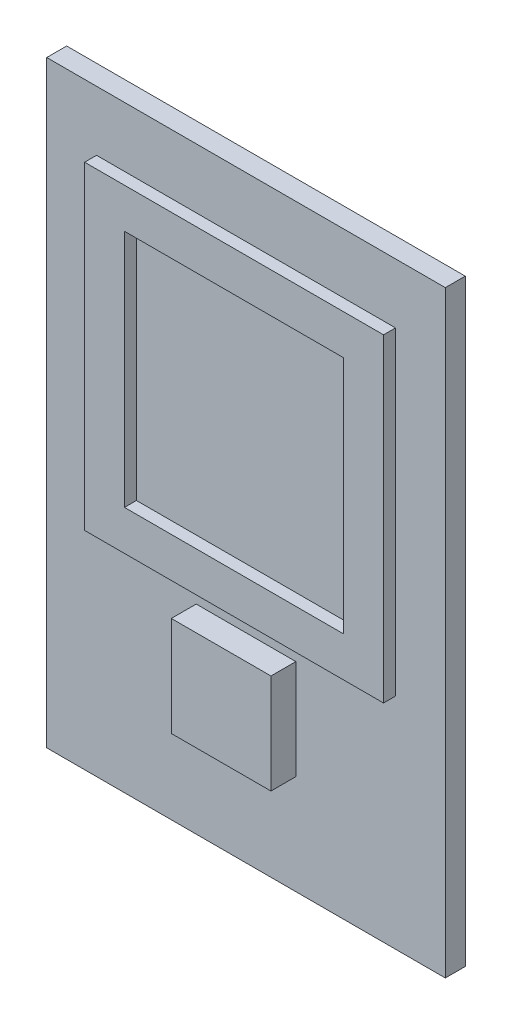
ISO-10303-21;
HEADER;
FILE_DESCRIPTION(('STEP AP214'),'2;1');
FILE_NAME('part.step','',(''),(''),'','','');
FILE_SCHEMA(('AUTOMOTIVE_DESIGN { 1 0 10303 214 1 1 1 1 }'));
ENDSEC;
DATA;
#1=APPLICATION_CONTEXT('core data for automotive mechanical design processes');
#2=APPLICATION_PROTOCOL_DEFINITION('international standard','automotive_design',2000,#1);
#3=PRODUCT_CONTEXT('',#1,'mechanical');
#4=PRODUCT('Part','Part','',(#3));
#5=PRODUCT_RELATED_PRODUCT_CATEGORY('part','',(#4));
#6=PRODUCT_DEFINITION_FORMATION('','',#4);
#7=PRODUCT_DEFINITION_CONTEXT('part definition',#1,'design');
#8=PRODUCT_DEFINITION('design','',#6,#7);
#9=PRODUCT_DEFINITION_SHAPE('','',#8);
#10=(LENGTH_UNIT() NAMED_UNIT(*) SI_UNIT(.MILLI.,.METRE.));
#11=(NAMED_UNIT(*) PLANE_ANGLE_UNIT() SI_UNIT($,.RADIAN.));
#12=(NAMED_UNIT(*) SI_UNIT($,.STERADIAN.) SOLID_ANGLE_UNIT());
#13=UNCERTAINTY_MEASURE_WITH_UNIT(LENGTH_MEASURE(1.E-05),#10,'distance_accuracy_value','');
#14=(GEOMETRIC_REPRESENTATION_CONTEXT(3) GLOBAL_UNCERTAINTY_ASSIGNED_CONTEXT((#13)) GLOBAL_UNIT_ASSIGNED_CONTEXT((#10,
#11,#12)) REPRESENTATION_CONTEXT('',''));
#15=CARTESIAN_POINT('',(0.,0.,0.));
#16=DIRECTION('',(0.,0.,1.));
#17=DIRECTION('',(1.,0.,0.));
#18=AXIS2_PLACEMENT_3D('',#15,#16,#17);
#19=CARTESIAN_POINT('',(0.,0.,2.));
#20=DIRECTION('',(0.,0.,-1.));
#21=DIRECTION('',(-1.,0.,0.));
#22=AXIS2_PLACEMENT_3D('',#19,#20,#21);
#23=PLANE('',#22);
#24=DIRECTION('',(0.,-1.,0.));
#25=VECTOR('',#24,1.);
#26=CARTESIAN_POINT('',(-15.,-8.,2.));
#27=LINE('',#26,#25);
#28=CARTESIAN_POINT('',(-15.,24.,2.));
#29=VERTEX_POINT('',#28);
#30=CARTESIAN_POINT('',(-15.,-8.,2.));
#31=VERTEX_POINT('',#30);
#32=EDGE_CURVE('E276',#29,#31,#27,.T.);
#33=ORIENTED_EDGE('',*,*,#32,.F.);
#34=DIRECTION('',(-1.,0.,0.));
#35=VECTOR('',#34,1.);
#36=CARTESIAN_POINT('',(-15.,24.,2.));
#37=LINE('',#36,#35);
#38=CARTESIAN_POINT('',(15.,24.,2.));
#39=VERTEX_POINT('',#38);
#40=EDGE_CURVE('E281',#39,#29,#37,.T.);
#41=ORIENTED_EDGE('',*,*,#40,.F.);
#42=DIRECTION('',(0.,1.,0.));
#43=VECTOR('',#42,1.);
#44=CARTESIAN_POINT('',(15.,-8.,2.));
#45=LINE('',#44,#43);
#46=CARTESIAN_POINT('',(15.,-8.,2.));
#47=VERTEX_POINT('',#46);
#48=EDGE_CURVE('E293',#47,#39,#45,.T.);
#49=ORIENTED_EDGE('',*,*,#48,.F.);
#50=DIRECTION('',(1.,0.,0.));
#51=VECTOR('',#50,1.);
#52=CARTESIAN_POINT('',(-15.,-8.,2.));
#53=LINE('',#52,#51);
#54=EDGE_CURVE('E290',#31,#47,#53,.T.);
#55=ORIENTED_EDGE('',*,*,#54,.F.);
#56=EDGE_LOOP('',(#33,#41,#49,#55));
#57=FACE_BOUND('',#56,.T.);
#58=DIRECTION('',(0.,-1.,0.));
#59=VECTOR('',#58,1.);
#60=CARTESIAN_POINT('',(-20.,-30.,2.));
#61=LINE('',#60,#59);
#62=CARTESIAN_POINT('',(-20.,30.,2.));
#63=VERTEX_POINT('',#62);
#64=CARTESIAN_POINT('',(-20.,-30.,2.));
#65=VERTEX_POINT('',#64);
#66=EDGE_CURVE('E310',#63,#65,#61,.T.);
#67=ORIENTED_EDGE('',*,*,#66,.T.);
#68=DIRECTION('',(1.,0.,0.));
#69=VECTOR('',#68,1.);
#70=CARTESIAN_POINT('',(-20.,-30.,2.));
#71=LINE('',#70,#69);
#72=CARTESIAN_POINT('',(20.,-30.,2.));
#73=VERTEX_POINT('',#72);
#74=EDGE_CURVE('E313',#65,#73,#71,.T.);
#75=ORIENTED_EDGE('',*,*,#74,.T.);
#76=DIRECTION('',(0.,1.,0.));
#77=VECTOR('',#76,1.);
#78=CARTESIAN_POINT('',(20.,-30.,2.));
#79=LINE('',#78,#77);
#80=CARTESIAN_POINT('',(20.,30.,2.));
#81=VERTEX_POINT('',#80);
#82=EDGE_CURVE('E316',#73,#81,#79,.T.);
#83=ORIENTED_EDGE('',*,*,#82,.T.);
#84=DIRECTION('',(-1.,0.,0.));
#85=VECTOR('',#84,1.);
#86=CARTESIAN_POINT('',(-20.,30.,2.));
#87=LINE('',#86,#85);
#88=EDGE_CURVE('E318',#81,#63,#87,.T.);
#89=ORIENTED_EDGE('',*,*,#88,.T.);
#90=EDGE_LOOP('',(#67,#75,#83,#89));
#91=FACE_BOUND('',#90,.T.);
#92=DIRECTION('',(0.,-1.,0.));
#93=VECTOR('',#92,1.);
#94=CARTESIAN_POINT('',(-5.,-20.,2.));
#95=LINE('',#94,#93);
#96=CARTESIAN_POINT('',(-5.,-10.,2.));
#97=VERTEX_POINT('',#96);
#98=CARTESIAN_POINT('',(-5.,-20.,2.));
#99=VERTEX_POINT('',#98);
#100=EDGE_CURVE('E210',#97,#99,#95,.T.);
#101=ORIENTED_EDGE('',*,*,#100,.F.);
#102=DIRECTION('',(-1.,0.,0.));
#103=VECTOR('',#102,1.);
#104=CARTESIAN_POINT('',(-5.,-10.,2.));
#105=LINE('',#104,#103);
#106=CARTESIAN_POINT('',(5.,-10.,2.));
#107=VERTEX_POINT('',#106);
#108=EDGE_CURVE('E218',#107,#97,#105,.T.);
#109=ORIENTED_EDGE('',*,*,#108,.F.);
#110=DIRECTION('',(0.,1.,0.));
#111=VECTOR('',#110,1.);
#112=CARTESIAN_POINT('',(5.,-20.,2.));
#113=LINE('',#112,#111);
#114=CARTESIAN_POINT('',(5.,-20.,2.));
#115=VERTEX_POINT('',#114);
#116=EDGE_CURVE('E230',#115,#107,#113,.T.);
#117=ORIENTED_EDGE('',*,*,#116,.F.);
#118=DIRECTION('',(1.,0.,0.));
#119=VECTOR('',#118,1.);
#120=CARTESIAN_POINT('',(-5.,-20.,2.));
#121=LINE('',#120,#119);
#122=EDGE_CURVE('E227',#99,#115,#121,.T.);
#123=ORIENTED_EDGE('',*,*,#122,.F.);
#124=EDGE_LOOP('',(#101,#109,#117,#123));
#125=FACE_BOUND('',#124,.T.);
#126=ADVANCED_FACE('F39',(#57,#91,#125),#23,.F.);
#127=CARTESIAN_POINT('',(-20.,-30.,2.));
#128=DIRECTION('',(1.,0.,0.));
#129=DIRECTION('',(0.,0.,-1.));
#130=AXIS2_PLACEMENT_3D('',#127,#128,#129);
#131=PLANE('',#130);
#132=DIRECTION('',(0.,-1.,0.));
#133=VECTOR('',#132,1.);
#134=CARTESIAN_POINT('',(-20.,-30.,0.));
#135=LINE('',#134,#133);
#136=CARTESIAN_POINT('',(-20.,30.,0.));
#137=VERTEX_POINT('',#136);
#138=CARTESIAN_POINT('',(-20.,-30.,0.));
#139=VERTEX_POINT('',#138);
#140=EDGE_CURVE('E309',#137,#139,#135,.T.);
#141=ORIENTED_EDGE('',*,*,#140,.T.);
#142=DIRECTION('',(0.,0.,-1.));
#143=VECTOR('',#142,1.);
#144=CARTESIAN_POINT('',(-20.,-30.,2.));
#145=LINE('',#144,#143);
#146=EDGE_CURVE('E11',#65,#139,#145,.T.);
#147=ORIENTED_EDGE('',*,*,#146,.F.);
#148=ORIENTED_EDGE('',*,*,#66,.F.);
#149=DIRECTION('',(0.,0.,-1.));
#150=VECTOR('',#149,1.);
#151=CARTESIAN_POINT('',(-20.,30.,2.));
#152=LINE('',#151,#150);
#153=EDGE_CURVE('E320',#63,#137,#152,.T.);
#154=ORIENTED_EDGE('',*,*,#153,.T.);
#155=EDGE_LOOP('',(#141,#147,#148,#154));
#156=FACE_BOUND('',#155,.T.);
#157=ADVANCED_FACE('F41',(#156),#131,.F.);
#158=CARTESIAN_POINT('',(-20.,-30.,2.));
#159=DIRECTION('',(0.,1.,0.));
#160=DIRECTION('',(0.,0.,1.));
#161=AXIS2_PLACEMENT_3D('',#158,#159,#160);
#162=PLANE('',#161);
#163=DIRECTION('',(1.,0.,0.));
#164=VECTOR('',#163,1.);
#165=CARTESIAN_POINT('',(-20.,-30.,0.));
#166=LINE('',#165,#164);
#167=CARTESIAN_POINT('',(20.,-30.,0.));
#168=VERTEX_POINT('',#167);
#169=EDGE_CURVE('E323',#139,#168,#166,.T.);
#170=ORIENTED_EDGE('',*,*,#169,.T.);
#171=DIRECTION('',(0.,0.,-1.));
#172=VECTOR('',#171,1.);
#173=CARTESIAN_POINT('',(20.,-30.,2.));
#174=LINE('',#173,#172);
#175=EDGE_CURVE('E47',#73,#168,#174,.T.);
#176=ORIENTED_EDGE('',*,*,#175,.F.);
#177=ORIENTED_EDGE('',*,*,#74,.F.);
#178=ORIENTED_EDGE('',*,*,#146,.T.);
#179=EDGE_LOOP('',(#170,#176,#177,#178));
#180=FACE_BOUND('',#179,.T.);
#181=ADVANCED_FACE('F353',(#180),#162,.F.);
#182=CARTESIAN_POINT('',(20.,-30.,2.));
#183=DIRECTION('',(-1.,0.,0.));
#184=DIRECTION('',(0.,0.,1.));
#185=AXIS2_PLACEMENT_3D('',#182,#183,#184);
#186=PLANE('',#185);
#187=DIRECTION('',(0.,1.,0.));
#188=VECTOR('',#187,1.);
#189=CARTESIAN_POINT('',(20.,-30.,0.));
#190=LINE('',#189,#188);
#191=CARTESIAN_POINT('',(20.,30.,0.));
#192=VERTEX_POINT('',#191);
#193=EDGE_CURVE('E325',#168,#192,#190,.T.);
#194=ORIENTED_EDGE('',*,*,#193,.T.);
#195=DIRECTION('',(0.,0.,-1.));
#196=VECTOR('',#195,1.);
#197=CARTESIAN_POINT('',(20.,30.,2.));
#198=LINE('',#197,#196);
#199=EDGE_CURVE('E330',#81,#192,#198,.T.);
#200=ORIENTED_EDGE('',*,*,#199,.F.);
#201=ORIENTED_EDGE('',*,*,#82,.F.);
#202=ORIENTED_EDGE('',*,*,#175,.T.);
#203=EDGE_LOOP('',(#194,#200,#201,#202));
#204=FACE_BOUND('',#203,.T.);
#205=ADVANCED_FACE('F337',(#204),#186,.F.);
#206=CARTESIAN_POINT('',(-20.,30.,2.));
#207=DIRECTION('',(0.,-1.,0.));
#208=DIRECTION('',(0.,0.,-1.));
#209=AXIS2_PLACEMENT_3D('',#206,#207,#208);
#210=PLANE('',#209);
#211=DIRECTION('',(-1.,0.,0.));
#212=VECTOR('',#211,1.);
#213=CARTESIAN_POINT('',(-20.,30.,0.));
#214=LINE('',#213,#212);
#215=EDGE_CURVE('E314',#192,#137,#214,.T.);
#216=ORIENTED_EDGE('',*,*,#215,.T.);
#217=ORIENTED_EDGE('',*,*,#153,.F.);
#218=ORIENTED_EDGE('',*,*,#88,.F.);
#219=ORIENTED_EDGE('',*,*,#199,.T.);
#220=EDGE_LOOP('',(#216,#217,#218,#219));
#221=FACE_BOUND('',#220,.T.);
#222=ADVANCED_FACE('F346',(#221),#210,.F.);
#223=CARTESIAN_POINT('',(0.,0.,0.));
#224=DIRECTION('',(0.,0.,-1.));
#225=DIRECTION('',(-1.,0.,0.));
#226=AXIS2_PLACEMENT_3D('',#223,#224,#225);
#227=PLANE('',#226);
#228=DIRECTION('',(0.,-1.,0.));
#229=VECTOR('',#228,1.);
#230=CARTESIAN_POINT('',(-11.,-29.,0.));
#231=LINE('',#230,#229);
#232=CARTESIAN_POINT('',(-11.,-26.,0.));
#233=VERTEX_POINT('',#232);
#234=CARTESIAN_POINT('',(-11.,-29.,0.));
#235=VERTEX_POINT('',#234);
#236=EDGE_CURVE('E205',#233,#235,#231,.T.);
#237=ORIENTED_EDGE('',*,*,#236,.T.);
#238=DIRECTION('',(1.,0.,0.));
#239=VECTOR('',#238,1.);
#240=CARTESIAN_POINT('',(-11.,-29.,0.));
#241=LINE('',#240,#239);
#242=CARTESIAN_POINT('',(11.,-29.,0.));
#243=VERTEX_POINT('',#242);
#244=EDGE_CURVE('E181',#235,#243,#241,.T.);
#245=ORIENTED_EDGE('',*,*,#244,.T.);
#246=DIRECTION('',(0.,1.,0.));
#247=VECTOR('',#246,1.);
#248=CARTESIAN_POINT('',(11.,-29.,0.));
#249=LINE('',#248,#247);
#250=CARTESIAN_POINT('',(11.,-26.,0.));
#251=VERTEX_POINT('',#250);
#252=EDGE_CURVE('E59',#243,#251,#249,.T.);
#253=ORIENTED_EDGE('',*,*,#252,.T.);
#254=DIRECTION('',(-1.,0.,0.));
#255=VECTOR('',#254,1.);
#256=CARTESIAN_POINT('',(-11.,-26.,0.));
#257=LINE('',#256,#255);
#258=EDGE_CURVE('E54',#251,#233,#257,.T.);
#259=ORIENTED_EDGE('',*,*,#258,.T.);
#260=EDGE_LOOP('',(#237,#245,#253,#259));
#261=FACE_BOUND('',#260,.T.);
#262=ORIENTED_EDGE('',*,*,#140,.F.);
#263=ORIENTED_EDGE('',*,*,#215,.F.);
#264=ORIENTED_EDGE('',*,*,#193,.F.);
#265=ORIENTED_EDGE('',*,*,#169,.F.);
#266=EDGE_LOOP('',(#262,#263,#264,#265));
#267=FACE_BOUND('',#266,.T.);
#268=ADVANCED_FACE('F343',(#261,#267),#227,.T.);
#269=CARTESIAN_POINT('',(0.,0.,3.2));
#270=DIRECTION('',(0.,0.,-1.));
#271=DIRECTION('',(-1.,0.,0.));
#272=AXIS2_PLACEMENT_3D('',#269,#270,#271);
#273=PLANE('',#272);
#274=DIRECTION('',(0.,-1.,0.));
#275=VECTOR('',#274,1.);
#276=CARTESIAN_POINT('',(-15.,-8.,3.2));
#277=LINE('',#276,#275);
#278=CARTESIAN_POINT('',(-15.,24.,3.2));
#279=VERTEX_POINT('',#278);
#280=CARTESIAN_POINT('',(-15.,-8.,3.2));
#281=VERTEX_POINT('',#280);
#282=EDGE_CURVE('E277',#279,#281,#277,.T.);
#283=ORIENTED_EDGE('',*,*,#282,.T.);
#284=DIRECTION('',(1.,0.,0.));
#285=VECTOR('',#284,1.);
#286=CARTESIAN_POINT('',(-15.,-8.,3.2));
#287=LINE('',#286,#285);
#288=CARTESIAN_POINT('',(15.,-8.,3.2));
#289=VERTEX_POINT('',#288);
#290=EDGE_CURVE('E280',#281,#289,#287,.T.);
#291=ORIENTED_EDGE('',*,*,#290,.T.);
#292=DIRECTION('',(0.,1.,0.));
#293=VECTOR('',#292,1.);
#294=CARTESIAN_POINT('',(15.,-8.,3.2));
#295=LINE('',#294,#293);
#296=CARTESIAN_POINT('',(15.,24.,3.2));
#297=VERTEX_POINT('',#296);
#298=EDGE_CURVE('E283',#289,#297,#295,.T.);
#299=ORIENTED_EDGE('',*,*,#298,.T.);
#300=DIRECTION('',(-1.,0.,0.));
#301=VECTOR('',#300,1.);
#302=CARTESIAN_POINT('',(-15.,24.,3.2));
#303=LINE('',#302,#301);
#304=EDGE_CURVE('E285',#297,#279,#303,.T.);
#305=ORIENTED_EDGE('',*,*,#304,.T.);
#306=EDGE_LOOP('',(#283,#291,#299,#305));
#307=FACE_BOUND('',#306,.T.);
#308=DIRECTION('',(0.,-1.,0.));
#309=VECTOR('',#308,1.);
#310=CARTESIAN_POINT('',(-11.,-4.,3.2));
#311=LINE('',#310,#309);
#312=CARTESIAN_POINT('',(-11.,20.,3.2));
#313=VERTEX_POINT('',#312);
#314=CARTESIAN_POINT('',(-11.,-4.,3.2));
#315=VERTEX_POINT('',#314);
#316=EDGE_CURVE('E247',#313,#315,#311,.T.);
#317=ORIENTED_EDGE('',*,*,#316,.F.);
#318=DIRECTION('',(-1.,0.,0.));
#319=VECTOR('',#318,1.);
#320=CARTESIAN_POINT('',(-11.,20.,3.2));
#321=LINE('',#320,#319);
#322=CARTESIAN_POINT('',(11.,20.,3.2));
#323=VERTEX_POINT('',#322);
#324=EDGE_CURVE('E255',#323,#313,#321,.T.);
#325=ORIENTED_EDGE('',*,*,#324,.F.);
#326=DIRECTION('',(0.,1.,0.));
#327=VECTOR('',#326,1.);
#328=CARTESIAN_POINT('',(11.,-4.,3.2));
#329=LINE('',#328,#327);
#330=CARTESIAN_POINT('',(11.,-4.,3.2));
#331=VERTEX_POINT('',#330);
#332=EDGE_CURVE('E252',#331,#323,#329,.T.);
#333=ORIENTED_EDGE('',*,*,#332,.F.);
#334=DIRECTION('',(1.,0.,0.));
#335=VECTOR('',#334,1.);
#336=CARTESIAN_POINT('',(-11.,-4.,3.2));
#337=LINE('',#336,#335);
#338=EDGE_CURVE('E249',#315,#331,#337,.T.);
#339=ORIENTED_EDGE('',*,*,#338,.F.);
#340=EDGE_LOOP('',(#317,#325,#333,#339));
#341=FACE_BOUND('',#340,.T.);
#342=ADVANCED_FACE('F397',(#307,#341),#273,.F.);
#343=CARTESIAN_POINT('',(-15.,-8.,3.2));
#344=DIRECTION('',(1.,0.,0.));
#345=DIRECTION('',(0.,0.,-1.));
#346=AXIS2_PLACEMENT_3D('',#343,#344,#345);
#347=PLANE('',#346);
#348=ORIENTED_EDGE('',*,*,#32,.T.);
#349=DIRECTION('',(0.,0.,-1.));
#350=VECTOR('',#349,1.);
#351=CARTESIAN_POINT('',(-15.,-8.,3.2));
#352=LINE('',#351,#350);
#353=EDGE_CURVE('E306',#281,#31,#352,.T.);
#354=ORIENTED_EDGE('',*,*,#353,.F.);
#355=ORIENTED_EDGE('',*,*,#282,.F.);
#356=DIRECTION('',(0.,0.,-1.));
#357=VECTOR('',#356,1.);
#358=CARTESIAN_POINT('',(-15.,24.,3.2));
#359=LINE('',#358,#357);
#360=EDGE_CURVE('E287',#279,#29,#359,.T.);
#361=ORIENTED_EDGE('',*,*,#360,.T.);
#362=EDGE_LOOP('',(#348,#354,#355,#361));
#363=FACE_BOUND('',#362,.T.);
#364=ADVANCED_FACE('F411',(#363),#347,.F.);
#365=CARTESIAN_POINT('',(-15.,-8.,3.2));
#366=DIRECTION('',(0.,1.,0.));
#367=DIRECTION('',(0.,0.,1.));
#368=AXIS2_PLACEMENT_3D('',#365,#366,#367);
#369=PLANE('',#368);
#370=ORIENTED_EDGE('',*,*,#54,.T.);
#371=DIRECTION('',(0.,0.,-1.));
#372=VECTOR('',#371,1.);
#373=CARTESIAN_POINT('',(15.,-8.,3.2));
#374=LINE('',#373,#372);
#375=EDGE_CURVE('E303',#289,#47,#374,.T.);
#376=ORIENTED_EDGE('',*,*,#375,.F.);
#377=ORIENTED_EDGE('',*,*,#290,.F.);
#378=ORIENTED_EDGE('',*,*,#353,.T.);
#379=EDGE_LOOP('',(#370,#376,#377,#378));
#380=FACE_BOUND('',#379,.T.);
#381=ADVANCED_FACE('F419',(#380),#369,.F.);
#382=CARTESIAN_POINT('',(15.,-8.,3.2));
#383=DIRECTION('',(-1.,0.,0.));
#384=DIRECTION('',(0.,0.,1.));
#385=AXIS2_PLACEMENT_3D('',#382,#383,#384);
#386=PLANE('',#385);
#387=ORIENTED_EDGE('',*,*,#48,.T.);
#388=DIRECTION('',(0.,0.,-1.));
#389=VECTOR('',#388,1.);
#390=CARTESIAN_POINT('',(15.,24.,3.2));
#391=LINE('',#390,#389);
#392=EDGE_CURVE('E300',#297,#39,#391,.T.);
#393=ORIENTED_EDGE('',*,*,#392,.F.);
#394=ORIENTED_EDGE('',*,*,#298,.F.);
#395=ORIENTED_EDGE('',*,*,#375,.T.);
#396=EDGE_LOOP('',(#387,#393,#394,#395));
#397=FACE_BOUND('',#396,.T.);
#398=ADVANCED_FACE('F415',(#397),#386,.F.);
#399=CARTESIAN_POINT('',(-15.,24.,3.2));
#400=DIRECTION('',(0.,-1.,0.));
#401=DIRECTION('',(0.,0.,-1.));
#402=AXIS2_PLACEMENT_3D('',#399,#400,#401);
#403=PLANE('',#402);
#404=ORIENTED_EDGE('',*,*,#40,.T.);
#405=ORIENTED_EDGE('',*,*,#360,.F.);
#406=ORIENTED_EDGE('',*,*,#304,.F.);
#407=ORIENTED_EDGE('',*,*,#392,.T.);
#408=EDGE_LOOP('',(#404,#405,#406,#407));
#409=FACE_BOUND('',#408,.T.);
#410=ADVANCED_FACE('F408',(#409),#403,.F.);
#411=CARTESIAN_POINT('',(-11.,-4.,3.2));
#412=DIRECTION('',(1.,0.,0.));
#413=DIRECTION('',(0.,0.,-1.));
#414=AXIS2_PLACEMENT_3D('',#411,#412,#413);
#415=PLANE('',#414);
#416=DIRECTION('',(0.,-1.,0.));
#417=VECTOR('',#416,1.);
#418=CARTESIAN_POINT('',(-11.,-4.,2.));
#419=LINE('',#418,#417);
#420=CARTESIAN_POINT('',(-11.,20.,2.));
#421=VERTEX_POINT('',#420);
#422=CARTESIAN_POINT('',(-11.,-4.,2.));
#423=VERTEX_POINT('',#422);
#424=EDGE_CURVE('E246',#421,#423,#419,.T.);
#425=ORIENTED_EDGE('',*,*,#424,.F.);
#426=DIRECTION('',(0.,0.,-1.));
#427=VECTOR('',#426,1.);
#428=CARTESIAN_POINT('',(-11.,20.,3.2));
#429=LINE('',#428,#427);
#430=EDGE_CURVE('E257',#313,#421,#429,.T.);
#431=ORIENTED_EDGE('',*,*,#430,.F.);
#432=ORIENTED_EDGE('',*,*,#316,.T.);
#433=DIRECTION('',(0.,0.,-1.));
#434=VECTOR('',#433,1.);
#435=CARTESIAN_POINT('',(-11.,-4.,3.2));
#436=LINE('',#435,#434);
#437=EDGE_CURVE('E273',#315,#423,#436,.T.);
#438=ORIENTED_EDGE('',*,*,#437,.T.);
#439=EDGE_LOOP('',(#425,#431,#432,#438));
#440=FACE_BOUND('',#439,.T.);
#441=ADVANCED_FACE('F389',(#440),#415,.T.);
#442=CARTESIAN_POINT('',(-11.,-4.,3.2));
#443=DIRECTION('',(0.,1.,0.));
#444=DIRECTION('',(0.,0.,1.));
#445=AXIS2_PLACEMENT_3D('',#442,#443,#444);
#446=PLANE('',#445);
#447=DIRECTION('',(1.,0.,0.));
#448=VECTOR('',#447,1.);
#449=CARTESIAN_POINT('',(-11.,-4.,2.));
#450=LINE('',#449,#448);
#451=CARTESIAN_POINT('',(11.,-4.,2.));
#452=VERTEX_POINT('',#451);
#453=EDGE_CURVE('E260',#423,#452,#450,.T.);
#454=ORIENTED_EDGE('',*,*,#453,.F.);
#455=ORIENTED_EDGE('',*,*,#437,.F.);
#456=ORIENTED_EDGE('',*,*,#338,.T.);
#457=DIRECTION('',(0.,0.,-1.));
#458=VECTOR('',#457,1.);
#459=CARTESIAN_POINT('',(11.,-4.,3.2));
#460=LINE('',#459,#458);
#461=EDGE_CURVE('E271',#331,#452,#460,.T.);
#462=ORIENTED_EDGE('',*,*,#461,.T.);
#463=EDGE_LOOP('',(#454,#455,#456,#462));
#464=FACE_BOUND('',#463,.T.);
#465=ADVANCED_FACE('F393',(#464),#446,.T.);
#466=CARTESIAN_POINT('',(11.,-4.,3.2));
#467=DIRECTION('',(-1.,0.,0.));
#468=DIRECTION('',(0.,0.,1.));
#469=AXIS2_PLACEMENT_3D('',#466,#467,#468);
#470=PLANE('',#469);
#471=DIRECTION('',(0.,1.,0.));
#472=VECTOR('',#471,1.);
#473=CARTESIAN_POINT('',(11.,-4.,2.));
#474=LINE('',#473,#472);
#475=CARTESIAN_POINT('',(11.,20.,2.));
#476=VERTEX_POINT('',#475);
#477=EDGE_CURVE('E263',#452,#476,#474,.T.);
#478=ORIENTED_EDGE('',*,*,#477,.F.);
#479=ORIENTED_EDGE('',*,*,#461,.F.);
#480=ORIENTED_EDGE('',*,*,#332,.T.);
#481=DIRECTION('',(0.,0.,-1.));
#482=VECTOR('',#481,1.);
#483=CARTESIAN_POINT('',(11.,20.,3.2));
#484=LINE('',#483,#482);
#485=EDGE_CURVE('E269',#323,#476,#484,.T.);
#486=ORIENTED_EDGE('',*,*,#485,.T.);
#487=EDGE_LOOP('',(#478,#479,#480,#486));
#488=FACE_BOUND('',#487,.T.);
#489=ADVANCED_FACE('F379',(#488),#470,.T.);
#490=CARTESIAN_POINT('',(-11.,20.,3.2));
#491=DIRECTION('',(0.,-1.,0.));
#492=DIRECTION('',(0.,0.,-1.));
#493=AXIS2_PLACEMENT_3D('',#490,#491,#492);
#494=PLANE('',#493);
#495=DIRECTION('',(-1.,0.,0.));
#496=VECTOR('',#495,1.);
#497=CARTESIAN_POINT('',(-11.,20.,2.));
#498=LINE('',#497,#496);
#499=EDGE_CURVE('E250',#476,#421,#498,.T.);
#500=ORIENTED_EDGE('',*,*,#499,.F.);
#501=ORIENTED_EDGE('',*,*,#485,.F.);
#502=ORIENTED_EDGE('',*,*,#324,.T.);
#503=ORIENTED_EDGE('',*,*,#430,.T.);
#504=EDGE_LOOP('',(#500,#501,#502,#503));
#505=FACE_BOUND('',#504,.T.);
#506=ADVANCED_FACE('F371',(#505),#494,.T.);
#507=ORIENTED_EDGE('',*,*,#499,.T.);
#508=ORIENTED_EDGE('',*,*,#424,.T.);
#509=ORIENTED_EDGE('',*,*,#453,.T.);
#510=ORIENTED_EDGE('',*,*,#477,.T.);
#511=EDGE_LOOP('',(#507,#508,#509,#510));
#512=FACE_BOUND('',#511,.T.);
#513=ADVANCED_FACE('F363',(#512),#23,.F.);
#514=CARTESIAN_POINT('',(-5.,-20.,4.5));
#515=DIRECTION('',(1.,0.,0.));
#516=DIRECTION('',(0.,0.,-1.));
#517=AXIS2_PLACEMENT_3D('',#514,#515,#516);
#518=PLANE('',#517);
#519=ORIENTED_EDGE('',*,*,#100,.T.);
#520=DIRECTION('',(0.,0.,-1.));
#521=VECTOR('',#520,1.);
#522=CARTESIAN_POINT('',(-5.,-20.,4.5));
#523=LINE('',#522,#521);
#524=CARTESIAN_POINT('',(-5.,-20.,4.5));
#525=VERTEX_POINT('',#524);
#526=EDGE_CURVE('E243',#525,#99,#523,.T.);
#527=ORIENTED_EDGE('',*,*,#526,.F.);
#528=DIRECTION('',(0.,-1.,0.));
#529=VECTOR('',#528,1.);
#530=CARTESIAN_POINT('',(-5.,-20.,4.5));
#531=LINE('',#530,#529);
#532=CARTESIAN_POINT('',(-5.,-10.,4.5));
#533=VERTEX_POINT('',#532);
#534=EDGE_CURVE('E214',#533,#525,#531,.T.);
#535=ORIENTED_EDGE('',*,*,#534,.F.);
#536=DIRECTION('',(0.,0.,-1.));
#537=VECTOR('',#536,1.);
#538=CARTESIAN_POINT('',(-5.,-10.,4.5));
#539=LINE('',#538,#537);
#540=EDGE_CURVE('E224',#533,#97,#539,.T.);
#541=ORIENTED_EDGE('',*,*,#540,.T.);
#542=EDGE_LOOP('',(#519,#527,#535,#541));
#543=FACE_BOUND('',#542,.T.);
#544=ADVANCED_FACE('F370',(#543),#518,.F.);
#545=CARTESIAN_POINT('',(-5.,-20.,4.5));
#546=DIRECTION('',(0.,1.,0.));
#547=DIRECTION('',(0.,0.,1.));
#548=AXIS2_PLACEMENT_3D('',#545,#546,#547);
#549=PLANE('',#548);
#550=ORIENTED_EDGE('',*,*,#122,.T.);
#551=DIRECTION('',(0.,0.,-1.));
#552=VECTOR('',#551,1.);
#553=CARTESIAN_POINT('',(5.,-20.,4.5));
#554=LINE('',#553,#552);
#555=CARTESIAN_POINT('',(5.,-20.,4.5));
#556=VERTEX_POINT('',#555);
#557=EDGE_CURVE('E240',#556,#115,#554,.T.);
#558=ORIENTED_EDGE('',*,*,#557,.F.);
#559=DIRECTION('',(1.,0.,0.));
#560=VECTOR('',#559,1.);
#561=CARTESIAN_POINT('',(-5.,-20.,4.5));
#562=LINE('',#561,#560);
#563=EDGE_CURVE('E217',#525,#556,#562,.T.);
#564=ORIENTED_EDGE('',*,*,#563,.F.);
#565=ORIENTED_EDGE('',*,*,#526,.T.);
#566=EDGE_LOOP('',(#550,#558,#564,#565));
#567=FACE_BOUND('',#566,.T.);
#568=ADVANCED_FACE('F376',(#567),#549,.F.);
#569=CARTESIAN_POINT('',(5.,-20.,4.5));
#570=DIRECTION('',(-1.,0.,0.));
#571=DIRECTION('',(0.,0.,1.));
#572=AXIS2_PLACEMENT_3D('',#569,#570,#571);
#573=PLANE('',#572);
#574=ORIENTED_EDGE('',*,*,#116,.T.);
#575=DIRECTION('',(0.,0.,-1.));
#576=VECTOR('',#575,1.);
#577=CARTESIAN_POINT('',(5.,-10.,4.5));
#578=LINE('',#577,#576);
#579=CARTESIAN_POINT('',(5.,-10.,4.5));
#580=VERTEX_POINT('',#579);
#581=EDGE_CURVE('E237',#580,#107,#578,.T.);
#582=ORIENTED_EDGE('',*,*,#581,.F.);
#583=DIRECTION('',(0.,1.,0.));
#584=VECTOR('',#583,1.);
#585=CARTESIAN_POINT('',(5.,-20.,4.5));
#586=LINE('',#585,#584);
#587=EDGE_CURVE('E220',#556,#580,#586,.T.);
#588=ORIENTED_EDGE('',*,*,#587,.F.);
#589=ORIENTED_EDGE('',*,*,#557,.T.);
#590=EDGE_LOOP('',(#574,#582,#588,#589));
#591=FACE_BOUND('',#590,.T.);
#592=ADVANCED_FACE('F492',(#591),#573,.F.);
#593=CARTESIAN_POINT('',(-5.,-10.,4.5));
#594=DIRECTION('',(0.,-1.,0.));
#595=DIRECTION('',(0.,0.,-1.));
#596=AXIS2_PLACEMENT_3D('',#593,#594,#595);
#597=PLANE('',#596);
#598=ORIENTED_EDGE('',*,*,#108,.T.);
#599=ORIENTED_EDGE('',*,*,#540,.F.);
#600=DIRECTION('',(-1.,0.,0.));
#601=VECTOR('',#600,1.);
#602=CARTESIAN_POINT('',(-5.,-10.,4.5));
#603=LINE('',#602,#601);
#604=EDGE_CURVE('E222',#580,#533,#603,.T.);
#605=ORIENTED_EDGE('',*,*,#604,.F.);
#606=ORIENTED_EDGE('',*,*,#581,.T.);
#607=EDGE_LOOP('',(#598,#599,#605,#606));
#608=FACE_BOUND('',#607,.T.);
#609=ADVANCED_FACE('F502',(#608),#597,.F.);
#610=CARTESIAN_POINT('',(0.,0.,4.5));
#611=DIRECTION('',(0.,0.,-1.));
#612=DIRECTION('',(-1.,0.,0.));
#613=AXIS2_PLACEMENT_3D('',#610,#611,#612);
#614=PLANE('',#613);
#615=ORIENTED_EDGE('',*,*,#534,.T.);
#616=ORIENTED_EDGE('',*,*,#563,.T.);
#617=ORIENTED_EDGE('',*,*,#587,.T.);
#618=ORIENTED_EDGE('',*,*,#604,.T.);
#619=EDGE_LOOP('',(#615,#616,#617,#618));
#620=FACE_BOUND('',#619,.T.);
#621=ADVANCED_FACE('F512',(#620),#614,.F.);
#622=CARTESIAN_POINT('',(-11.,-29.,-5.));
#623=DIRECTION('',(-1.,0.,0.));
#624=DIRECTION('',(0.,0.,1.));
#625=AXIS2_PLACEMENT_3D('',#622,#623,#624);
#626=PLANE('',#625);
#627=ORIENTED_EDGE('',*,*,#236,.F.);
#628=DIRECTION('',(0.,0.,1.));
#629=VECTOR('',#628,1.);
#630=CARTESIAN_POINT('',(-11.,-26.,-5.));
#631=LINE('',#630,#629);
#632=CARTESIAN_POINT('',(-11.,-26.,-5.));
#633=VERTEX_POINT('',#632);
#634=EDGE_CURVE('E199',#633,#233,#631,.T.);
#635=ORIENTED_EDGE('',*,*,#634,.F.);
#636=DIRECTION('',(0.,-1.,0.));
#637=VECTOR('',#636,1.);
#638=CARTESIAN_POINT('',(-11.,-29.,-5.));
#639=LINE('',#638,#637);
#640=CARTESIAN_POINT('',(-11.,-29.,-5.));
#641=VERTEX_POINT('',#640);
#642=EDGE_CURVE('E193',#633,#641,#639,.T.);
#643=ORIENTED_EDGE('',*,*,#642,.T.);
#644=DIRECTION('',(0.,0.,1.));
#645=VECTOR('',#644,1.);
#646=CARTESIAN_POINT('',(-11.,-29.,-5.));
#647=LINE('',#646,#645);
#648=EDGE_CURVE('E176',#641,#235,#647,.T.);
#649=ORIENTED_EDGE('',*,*,#648,.T.);
#650=EDGE_LOOP('',(#627,#635,#643,#649));
#651=FACE_BOUND('',#650,.T.);
#652=ADVANCED_FACE('F198',(#651),#626,.T.);
#653=CARTESIAN_POINT('',(-11.,-26.,-5.));
#654=DIRECTION('',(0.,1.,0.));
#655=DIRECTION('',(0.,0.,1.));
#656=AXIS2_PLACEMENT_3D('',#653,#654,#655);
#657=PLANE('',#656);
#658=ORIENTED_EDGE('',*,*,#258,.F.);
#659=DIRECTION('',(0.,0.,1.));
#660=VECTOR('',#659,1.);
#661=CARTESIAN_POINT('',(11.,-26.,-5.));
#662=LINE('',#661,#660);
#663=CARTESIAN_POINT('',(11.,-26.,-5.));
#664=VERTEX_POINT('',#663);
#665=EDGE_CURVE('E211',#664,#251,#662,.T.);
#666=ORIENTED_EDGE('',*,*,#665,.F.);
#667=DIRECTION('',(-1.,0.,0.));
#668=VECTOR('',#667,1.);
#669=CARTESIAN_POINT('',(-11.,-26.,-5.));
#670=LINE('',#669,#668);
#671=EDGE_CURVE('E186',#664,#633,#670,.T.);
#672=ORIENTED_EDGE('',*,*,#671,.T.);
#673=ORIENTED_EDGE('',*,*,#634,.T.);
#674=EDGE_LOOP('',(#658,#666,#672,#673));
#675=FACE_BOUND('',#674,.T.);
#676=ADVANCED_FACE('F532',(#675),#657,.T.);
#677=CARTESIAN_POINT('',(11.,-29.,-5.));
#678=DIRECTION('',(1.,0.,0.));
#679=DIRECTION('',(0.,0.,-1.));
#680=AXIS2_PLACEMENT_3D('',#677,#678,#679);
#681=PLANE('',#680);
#682=ORIENTED_EDGE('',*,*,#252,.F.);
#683=DIRECTION('',(0.,0.,1.));
#684=VECTOR('',#683,1.);
#685=CARTESIAN_POINT('',(11.,-29.,-5.));
#686=LINE('',#685,#684);
#687=CARTESIAN_POINT('',(11.,-29.,-5.));
#688=VERTEX_POINT('',#687);
#689=EDGE_CURVE('E185',#688,#243,#686,.T.);
#690=ORIENTED_EDGE('',*,*,#689,.F.);
#691=DIRECTION('',(0.,1.,0.));
#692=VECTOR('',#691,1.);
#693=CARTESIAN_POINT('',(11.,-29.,-5.));
#694=LINE('',#693,#692);
#695=EDGE_CURVE('E196',#688,#664,#694,.T.);
#696=ORIENTED_EDGE('',*,*,#695,.T.);
#697=ORIENTED_EDGE('',*,*,#665,.T.);
#698=EDGE_LOOP('',(#682,#690,#696,#697));
#699=FACE_BOUND('',#698,.T.);
#700=ADVANCED_FACE('F541',(#699),#681,.T.);
#701=CARTESIAN_POINT('',(-11.,-29.,-5.));
#702=DIRECTION('',(0.,-1.,0.));
#703=DIRECTION('',(0.,0.,-1.));
#704=AXIS2_PLACEMENT_3D('',#701,#702,#703);
#705=PLANE('',#704);
#706=ORIENTED_EDGE('',*,*,#244,.F.);
#707=ORIENTED_EDGE('',*,*,#648,.F.);
#708=DIRECTION('',(1.,0.,0.));
#709=VECTOR('',#708,1.);
#710=CARTESIAN_POINT('',(-11.,-29.,-5.));
#711=LINE('',#710,#709);
#712=EDGE_CURVE('E180',#641,#688,#711,.T.);
#713=ORIENTED_EDGE('',*,*,#712,.T.);
#714=ORIENTED_EDGE('',*,*,#689,.T.);
#715=EDGE_LOOP('',(#706,#707,#713,#714));
#716=FACE_BOUND('',#715,.T.);
#717=ADVANCED_FACE('F178',(#716),#705,.T.);
#718=CARTESIAN_POINT('',(0.,0.,-5.));
#719=DIRECTION('',(0.,0.,-1.));
#720=DIRECTION('',(-1.,0.,0.));
#721=AXIS2_PLACEMENT_3D('',#718,#719,#720);
#722=PLANE('',#721);
#723=ORIENTED_EDGE('',*,*,#642,.F.);
#724=ORIENTED_EDGE('',*,*,#671,.F.);
#725=ORIENTED_EDGE('',*,*,#695,.F.);
#726=ORIENTED_EDGE('',*,*,#712,.F.);
#727=EDGE_LOOP('',(#723,#724,#725,#726));
#728=FACE_BOUND('',#727,.T.);
#729=ADVANCED_FACE('F191',(#728),#722,.T.);
#730=CLOSED_SHELL('',(#126,#157,#181,#205,#222,#268,#342,#364,#381,#398,#410,#441,#465,#489,
#506,#513,#544,#568,#592,#609,#621,#652,#676,#700,#717,#729));
#731=MANIFOLD_SOLID_BREP('B2',#730);
#732=ADVANCED_BREP_SHAPE_REPRESENTATION('',(#18,#731),#14);
#733=SHAPE_DEFINITION_REPRESENTATION(#9,#732);
ENDSEC;
END-ISO-10303-21;
